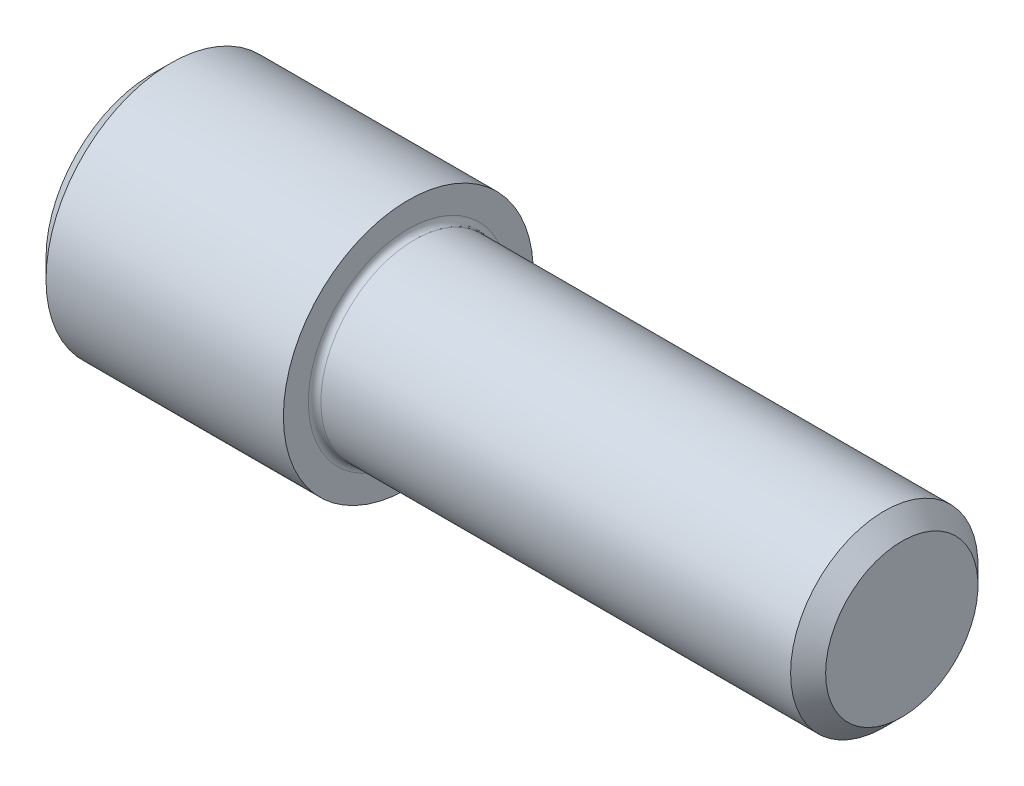
ISO-10303-21;
HEADER;
FILE_DESCRIPTION(('STEP AP214'),'2;1');
FILE_NAME('part.step','',(''),(''),'','','');
FILE_SCHEMA(('AUTOMOTIVE_DESIGN { 1 0 10303 214 1 1 1 1 }'));
ENDSEC;
DATA;
#1=APPLICATION_CONTEXT('core data for automotive mechanical design processes');
#2=APPLICATION_PROTOCOL_DEFINITION('international standard','automotive_design',2000,#1);
#3=PRODUCT_CONTEXT('',#1,'mechanical');
#4=PRODUCT('Part','Part','',(#3));
#5=PRODUCT_RELATED_PRODUCT_CATEGORY('part','',(#4));
#6=PRODUCT_DEFINITION_FORMATION('','',#4);
#7=PRODUCT_DEFINITION_CONTEXT('part definition',#1,'design');
#8=PRODUCT_DEFINITION('design','',#6,#7);
#9=PRODUCT_DEFINITION_SHAPE('','',#8);
#10=(LENGTH_UNIT() NAMED_UNIT(*) SI_UNIT(.MILLI.,.METRE.));
#11=(NAMED_UNIT(*) PLANE_ANGLE_UNIT() SI_UNIT($,.RADIAN.));
#12=(NAMED_UNIT(*) SI_UNIT($,.STERADIAN.) SOLID_ANGLE_UNIT());
#13=UNCERTAINTY_MEASURE_WITH_UNIT(LENGTH_MEASURE(1.E-05),#10,'distance_accuracy_value','');
#14=(GEOMETRIC_REPRESENTATION_CONTEXT(3) GLOBAL_UNCERTAINTY_ASSIGNED_CONTEXT((#13)) GLOBAL_UNIT_ASSIGNED_CONTEXT((#10,
#11,#12)) REPRESENTATION_CONTEXT('',''));
#15=CARTESIAN_POINT('',(0.,0.,0.));
#16=DIRECTION('',(0.,0.,1.));
#17=DIRECTION('',(1.,0.,0.));
#18=AXIS2_PLACEMENT_3D('',#15,#16,#17);
#19=CARTESIAN_POINT('',(0.,0.,0.));
#20=DIRECTION('',(-1.,0.,0.));
#21=DIRECTION('',(0.,0.,1.));
#22=AXIS2_PLACEMENT_3D('',#19,#20,#21);
#23=PLANE('',#22);
#24=DIRECTION('',(0.,-0.5,0.866025403784439));
#25=VECTOR('',#24,1.);
#26=CARTESIAN_POINT('',(0.,1.47801668912544,0.));
#27=LINE('',#26,#25);
#28=CARTESIAN_POINT('',(0.,1.47801668912544,0.));
#29=VERTEX_POINT('',#28);
#30=CARTESIAN_POINT('',(0.,0.739008344562719,1.28));
#31=VERTEX_POINT('',#30);
#32=EDGE_CURVE('E274',#29,#31,#27,.T.);
#33=ORIENTED_EDGE('',*,*,#32,.T.);
#34=DIRECTION('',(0.,1.,0.));
#35=VECTOR('',#34,1.);
#36=CARTESIAN_POINT('',(0.,-0.739008344562723,1.28));
#37=LINE('',#36,#35);
#38=CARTESIAN_POINT('',(0.,-0.739008344562723,1.28));
#39=VERTEX_POINT('',#38);
#40=EDGE_CURVE('E145',#39,#31,#37,.T.);
#41=ORIENTED_EDGE('',*,*,#40,.F.);
#42=DIRECTION('',(0.,-0.500000000000001,-0.866025403784438));
#43=VECTOR('',#42,1.);
#44=CARTESIAN_POINT('',(0.,-0.739008344562723,1.28));
#45=LINE('',#44,#43);
#46=CARTESIAN_POINT('',(0.,-1.47801668912545,0.));
#47=VERTEX_POINT('',#46);
#48=EDGE_CURVE('E277',#39,#47,#45,.T.);
#49=ORIENTED_EDGE('',*,*,#48,.T.);
#50=DIRECTION('',(0.,0.5,-0.866025403784439));
#51=VECTOR('',#50,1.);
#52=CARTESIAN_POINT('',(0.,-1.47801668912545,0.));
#53=LINE('',#52,#51);
#54=CARTESIAN_POINT('',(0.,-0.739008344562725,-1.28));
#55=VERTEX_POINT('',#54);
#56=EDGE_CURVE('E280',#47,#55,#53,.T.);
#57=ORIENTED_EDGE('',*,*,#56,.T.);
#58=DIRECTION('',(0.,-1.,0.));
#59=VECTOR('',#58,1.);
#60=CARTESIAN_POINT('',(0.,0.739008344562717,-1.28));
#61=LINE('',#60,#59);
#62=CARTESIAN_POINT('',(0.,0.739008344562717,-1.28));
#63=VERTEX_POINT('',#62);
#64=EDGE_CURVE('E283',#63,#55,#61,.T.);
#65=ORIENTED_EDGE('',*,*,#64,.F.);
#66=DIRECTION('',(0.,-0.500000000000001,-0.866025403784438));
#67=VECTOR('',#66,1.);
#68=CARTESIAN_POINT('',(0.,1.47801668912544,0.));
#69=LINE('',#68,#67);
#70=EDGE_CURVE('E140',#29,#63,#69,.T.);
#71=ORIENTED_EDGE('',*,*,#70,.F.);
#72=EDGE_LOOP('',(#33,#41,#49,#57,#65,#71));
#73=FACE_BOUND('',#72,.T.);
#74=CARTESIAN_POINT('',(0.,0.,0.));
#75=DIRECTION('',(-1.,0.,0.));
#76=DIRECTION('',(0.,0.,1.));
#77=AXIS2_PLACEMENT_3D('',#74,#75,#76);
#78=CIRCLE('',#77,1.7);
#79=CARTESIAN_POINT('',(0.,0.,1.7));
#80=VERTEX_POINT('',#79);
#81=EDGE_CURVE('E169',#80,#80,#78,.T.);
#82=ORIENTED_EDGE('',*,*,#81,.T.);
#83=EDGE_LOOP('',(#82));
#84=FACE_BOUND('',#83,.T.);
#85=ADVANCED_FACE('F49',(#73,#84),#23,.T.);
#86=CARTESIAN_POINT('',(0.,0.,0.));
#87=DIRECTION('',(1.,0.,0.));
#88=DIRECTION('',(0.,0.,-1.));
#89=AXIS2_PLACEMENT_3D('',#86,#87,#88);
#90=CONICAL_SURFACE('',#89,1.7,0.78539816339745);
#91=CARTESIAN_POINT('',(0.300000000000002,0.,0.));
#92=DIRECTION('',(-1.,0.,0.));
#93=DIRECTION('',(0.,0.,1.));
#94=AXIS2_PLACEMENT_3D('',#91,#92,#93);
#95=CIRCLE('',#94,2.);
#96=CARTESIAN_POINT('',(0.300000000000002,0.,2.));
#97=VERTEX_POINT('',#96);
#98=EDGE_CURVE('E166',#97,#97,#95,.T.);
#99=ORIENTED_EDGE('',*,*,#98,.T.);
#100=EDGE_LOOP('',(#99));
#101=FACE_BOUND('',#100,.T.);
#102=ORIENTED_EDGE('',*,*,#81,.F.);
#103=EDGE_LOOP('',(#102));
#104=FACE_BOUND('',#103,.T.);
#105=ADVANCED_FACE('F190',(#101,#104),#90,.T.);
#106=CARTESIAN_POINT('',(-31.75,0.,0.));
#107=DIRECTION('',(-1.,0.,0.));
#108=DIRECTION('',(0.,0.,1.));
#109=AXIS2_PLACEMENT_3D('',#106,#107,#108);
#110=CYLINDRICAL_SURFACE('',#109,2.);
#111=CARTESIAN_POINT('',(4.1,0.,0.));
#112=DIRECTION('',(-1.,0.,0.));
#113=DIRECTION('',(0.,0.,1.));
#114=AXIS2_PLACEMENT_3D('',#111,#112,#113);
#115=CIRCLE('',#114,2.);
#116=CARTESIAN_POINT('',(4.1,0.,2.));
#117=VERTEX_POINT('',#116);
#118=EDGE_CURVE('E163',#117,#117,#115,.T.);
#119=ORIENTED_EDGE('',*,*,#118,.T.);
#120=EDGE_LOOP('',(#119));
#121=FACE_BOUND('',#120,.T.);
#122=ORIENTED_EDGE('',*,*,#98,.F.);
#123=EDGE_LOOP('',(#122));
#124=FACE_BOUND('',#123,.T.);
#125=ADVANCED_FACE('F195',(#121,#124),#110,.T.);
#126=CARTESIAN_POINT('',(4.1,2.,0.));
#127=DIRECTION('',(1.,0.,0.));
#128=DIRECTION('',(0.,0.,-1.));
#129=AXIS2_PLACEMENT_3D('',#126,#127,#128);
#130=PLANE('',#129);
#131=CARTESIAN_POINT('',(4.1,0.,0.));
#132=DIRECTION('',(1.,0.,0.));
#133=DIRECTION('',(0.,0.,-1.));
#134=AXIS2_PLACEMENT_3D('',#131,#132,#133);
#135=CIRCLE('',#134,1.59999999999997);
#136=CARTESIAN_POINT('',(4.1,0.,-1.59999999999997));
#137=VERTEX_POINT('',#136);
#138=EDGE_CURVE('E57',#137,#137,#135,.F.);
#139=ORIENTED_EDGE('',*,*,#138,.T.);
#140=EDGE_LOOP('',(#139));
#141=FACE_BOUND('',#140,.T.);
#142=ORIENTED_EDGE('',*,*,#118,.F.);
#143=EDGE_LOOP('',(#142));
#144=FACE_BOUND('',#143,.T.);
#145=ADVANCED_FACE('F174',(#141,#144),#130,.T.);
#146=CARTESIAN_POINT('',(-31.75,0.,0.));
#147=DIRECTION('',(-1.,0.,0.));
#148=DIRECTION('',(0.,0.,1.));
#149=AXIS2_PLACEMENT_3D('',#146,#147,#148);
#150=CYLINDRICAL_SURFACE('',#149,1.49999999999997);
#151=CARTESIAN_POINT('',(4.2,0.,0.));
#152=DIRECTION('',(1.,0.,0.));
#153=DIRECTION('',(0.,0.,-1.));
#154=AXIS2_PLACEMENT_3D('',#151,#152,#153);
#155=CIRCLE('',#154,1.49999999999997);
#156=CARTESIAN_POINT('',(4.2,0.,-1.49999999999997));
#157=VERTEX_POINT('',#156);
#158=EDGE_CURVE('E13',#157,#157,#155,.T.);
#159=ORIENTED_EDGE('',*,*,#158,.T.);
#160=EDGE_LOOP('',(#159));
#161=FACE_BOUND('',#160,.T.);
#162=CARTESIAN_POINT('',(11.7195,0.,0.));
#163=DIRECTION('',(-1.,0.,0.));
#164=DIRECTION('',(0.,0.,1.));
#165=AXIS2_PLACEMENT_3D('',#162,#163,#164);
#166=CIRCLE('',#165,1.49999999999995);
#167=CARTESIAN_POINT('',(11.7195,0.,1.49999999999995));
#168=VERTEX_POINT('',#167);
#169=EDGE_CURVE('E160',#168,#168,#166,.T.);
#170=ORIENTED_EDGE('',*,*,#169,.T.);
#171=EDGE_LOOP('',(#170));
#172=FACE_BOUND('',#171,.T.);
#173=ADVANCED_FACE('F205',(#161,#172),#150,.T.);
#174=CARTESIAN_POINT('',(12.,0.,0.));
#175=DIRECTION('',(-1.,0.,0.));
#176=DIRECTION('',(0.,0.,1.));
#177=AXIS2_PLACEMENT_3D('',#174,#175,#176);
#178=CONICAL_SURFACE('',#177,1.2195,0.785398163397311);
#179=ORIENTED_EDGE('',*,*,#169,.F.);
#180=EDGE_LOOP('',(#179));
#181=FACE_BOUND('',#180,.T.);
#182=CARTESIAN_POINT('',(12.,0.,0.));
#183=DIRECTION('',(-1.,0.,0.));
#184=DIRECTION('',(0.,0.,1.));
#185=AXIS2_PLACEMENT_3D('',#182,#183,#184);
#186=CIRCLE('',#185,1.2195);
#187=CARTESIAN_POINT('',(12.,0.,1.2195));
#188=VERTEX_POINT('',#187);
#189=EDGE_CURVE('E156',#188,#188,#186,.T.);
#190=ORIENTED_EDGE('',*,*,#189,.T.);
#191=EDGE_LOOP('',(#190));
#192=FACE_BOUND('',#191,.T.);
#193=ADVANCED_FACE('F185',(#181,#192),#178,.T.);
#194=CARTESIAN_POINT('',(12.,1.2195,0.));
#195=DIRECTION('',(1.,0.,0.));
#196=DIRECTION('',(0.,0.,-1.));
#197=AXIS2_PLACEMENT_3D('',#194,#195,#196);
#198=PLANE('',#197);
#199=ORIENTED_EDGE('',*,*,#189,.F.);
#200=EDGE_LOOP('',(#199));
#201=FACE_BOUND('',#200,.T.);
#202=ADVANCED_FACE('F178',(#201),#198,.T.);
#203=CARTESIAN_POINT('',(4.2,0.,0.));
#204=DIRECTION('',(1.,0.,0.));
#205=DIRECTION('',(0.,0.,-1.));
#206=AXIS2_PLACEMENT_3D('',#203,#204,#205);
#207=TOROIDAL_SURFACE('',#206,1.59999999999997,0.1);
#208=ORIENTED_EDGE('',*,*,#158,.F.);
#209=EDGE_LOOP('',(#208));
#210=FACE_BOUND('',#209,.T.);
#211=ORIENTED_EDGE('',*,*,#138,.F.);
#212=EDGE_LOOP('',(#211));
#213=FACE_BOUND('',#212,.T.);
#214=ADVANCED_FACE('F51',(#210,#213),#207,.F.);
#215=CARTESIAN_POINT('',(1.3,1.47801668912544,0.));
#216=DIRECTION('',(0.,-0.866025403784439,-0.5));
#217=DIRECTION('',(0.,0.5,-0.866025403784439));
#218=AXIS2_PLACEMENT_3D('',#215,#216,#217);
#219=PLANE('',#218);
#220=ORIENTED_EDGE('',*,*,#32,.F.);
#221=DIRECTION('',(-1.,0.,0.));
#222=VECTOR('',#221,1.);
#223=CARTESIAN_POINT('',(1.3,1.47801668912544,0.));
#224=LINE('',#223,#222);
#225=CARTESIAN_POINT('',(1.3,1.47801668912544,0.));
#226=VERTEX_POINT('',#225);
#227=EDGE_CURVE('E264',#226,#29,#224,.T.);
#228=ORIENTED_EDGE('',*,*,#227,.F.);
#229=DIRECTION('',(0.,-0.5,0.866025403784439));
#230=VECTOR('',#229,1.);
#231=CARTESIAN_POINT('',(1.3,1.47801668912544,0.));
#232=LINE('',#231,#230);
#233=CARTESIAN_POINT('',(1.3,1.10851251684408,0.639999999999998));
#234=VERTEX_POINT('',#233);
#235=EDGE_CURVE('E132',#226,#234,#232,.T.);
#236=ORIENTED_EDGE('',*,*,#235,.T.);
#237=CARTESIAN_POINT('',(1.3,0.739008344562719,1.28));
#238=VERTEX_POINT('',#237);
#239=EDGE_CURVE('E123',#234,#238,#232,.T.);
#240=ORIENTED_EDGE('',*,*,#239,.T.);
#241=DIRECTION('',(-1.,0.,0.));
#242=VECTOR('',#241,1.);
#243=CARTESIAN_POINT('',(1.3,0.739008344562719,1.28));
#244=LINE('',#243,#242);
#245=EDGE_CURVE('E137',#238,#31,#244,.T.);
#246=ORIENTED_EDGE('',*,*,#245,.T.);
#247=EDGE_LOOP('',(#220,#228,#236,#240,#246));
#248=FACE_BOUND('',#247,.T.);
#249=ADVANCED_FACE('F136',(#248),#219,.T.);
#250=CARTESIAN_POINT('',(1.3,-0.739008344562723,1.28));
#251=DIRECTION('',(0.,0.,1.));
#252=DIRECTION('',(0.,-1.,0.));
#253=AXIS2_PLACEMENT_3D('',#250,#251,#252);
#254=PLANE('',#253);
#255=ORIENTED_EDGE('',*,*,#40,.T.);
#256=ORIENTED_EDGE('',*,*,#245,.F.);
#257=DIRECTION('',(0.,1.,0.));
#258=VECTOR('',#257,1.);
#259=CARTESIAN_POINT('',(1.3,-0.739008344562723,1.28));
#260=LINE('',#259,#258);
#261=CARTESIAN_POINT('',(1.3,0.,1.28));
#262=VERTEX_POINT('',#261);
#263=EDGE_CURVE('E120',#262,#238,#260,.T.);
#264=ORIENTED_EDGE('',*,*,#263,.F.);
#265=CARTESIAN_POINT('',(1.3,-0.739008344562723,1.28));
#266=VERTEX_POINT('',#265);
#267=EDGE_CURVE('E131',#266,#262,#260,.T.);
#268=ORIENTED_EDGE('',*,*,#267,.F.);
#269=DIRECTION('',(-1.,0.,0.));
#270=VECTOR('',#269,1.);
#271=CARTESIAN_POINT('',(1.3,-0.739008344562723,1.28));
#272=LINE('',#271,#270);
#273=EDGE_CURVE('E147',#266,#39,#272,.T.);
#274=ORIENTED_EDGE('',*,*,#273,.T.);
#275=EDGE_LOOP('',(#255,#256,#264,#268,#274));
#276=FACE_BOUND('',#275,.T.);
#277=ADVANCED_FACE('F142',(#276),#254,.F.);
#278=CARTESIAN_POINT('',(1.3,-0.739008344562723,1.28));
#279=DIRECTION('',(0.,0.866025403784438,-0.500000000000001));
#280=DIRECTION('',(0.,0.500000000000001,0.866025403784438));
#281=AXIS2_PLACEMENT_3D('',#278,#279,#280);
#282=PLANE('',#281);
#283=ORIENTED_EDGE('',*,*,#48,.F.);
#284=ORIENTED_EDGE('',*,*,#273,.F.);
#285=DIRECTION('',(0.,-0.500000000000001,-0.866025403784438));
#286=VECTOR('',#285,1.);
#287=CARTESIAN_POINT('',(1.3,-0.739008344562723,1.28));
#288=LINE('',#287,#286);
#289=CARTESIAN_POINT('',(1.3,-1.10851251684408,0.640000000000003));
#290=VERTEX_POINT('',#289);
#291=EDGE_CURVE('E303',#266,#290,#288,.T.);
#292=ORIENTED_EDGE('',*,*,#291,.T.);
#293=CARTESIAN_POINT('',(1.3,-1.47801668912545,0.));
#294=VERTEX_POINT('',#293);
#295=EDGE_CURVE('E292',#290,#294,#288,.T.);
#296=ORIENTED_EDGE('',*,*,#295,.T.);
#297=DIRECTION('',(-1.,0.,0.));
#298=VECTOR('',#297,1.);
#299=CARTESIAN_POINT('',(1.3,-1.47801668912545,0.));
#300=LINE('',#299,#298);
#301=EDGE_CURVE('E152',#294,#47,#300,.T.);
#302=ORIENTED_EDGE('',*,*,#301,.T.);
#303=EDGE_LOOP('',(#283,#284,#292,#296,#302));
#304=FACE_BOUND('',#303,.T.);
#305=ADVANCED_FACE('F218',(#304),#282,.T.);
#306=CARTESIAN_POINT('',(1.3,-1.47801668912545,0.));
#307=DIRECTION('',(0.,0.866025403784439,0.5));
#308=DIRECTION('',(0.,-0.5,0.866025403784439));
#309=AXIS2_PLACEMENT_3D('',#306,#307,#308);
#310=PLANE('',#309);
#311=ORIENTED_EDGE('',*,*,#56,.F.);
#312=ORIENTED_EDGE('',*,*,#301,.F.);
#313=DIRECTION('',(0.,0.5,-0.866025403784439));
#314=VECTOR('',#313,1.);
#315=CARTESIAN_POINT('',(1.3,-1.47801668912545,0.));
#316=LINE('',#315,#314);
#317=CARTESIAN_POINT('',(1.3,-1.10851251684409,-0.640000000000002));
#318=VERTEX_POINT('',#317);
#319=EDGE_CURVE('E270',#294,#318,#316,.T.);
#320=ORIENTED_EDGE('',*,*,#319,.T.);
#321=CARTESIAN_POINT('',(1.3,-0.739008344562725,-1.28));
#322=VERTEX_POINT('',#321);
#323=EDGE_CURVE('E302',#318,#322,#316,.T.);
#324=ORIENTED_EDGE('',*,*,#323,.T.);
#325=DIRECTION('',(-1.,0.,0.));
#326=VECTOR('',#325,1.);
#327=CARTESIAN_POINT('',(1.3,-0.739008344562725,-1.28));
#328=LINE('',#327,#326);
#329=EDGE_CURVE('E263',#322,#55,#328,.T.);
#330=ORIENTED_EDGE('',*,*,#329,.T.);
#331=EDGE_LOOP('',(#311,#312,#320,#324,#330));
#332=FACE_BOUND('',#331,.T.);
#333=ADVANCED_FACE('F221',(#332),#310,.T.);
#334=CARTESIAN_POINT('',(1.3,0.739008344562717,-1.28));
#335=DIRECTION('',(0.,0.,-1.));
#336=DIRECTION('',(0.,1.,0.));
#337=AXIS2_PLACEMENT_3D('',#334,#335,#336);
#338=PLANE('',#337);
#339=ORIENTED_EDGE('',*,*,#64,.T.);
#340=ORIENTED_EDGE('',*,*,#329,.F.);
#341=DIRECTION('',(0.,-1.,0.));
#342=VECTOR('',#341,1.);
#343=CARTESIAN_POINT('',(1.3,0.739008344562717,-1.28));
#344=LINE('',#343,#342);
#345=CARTESIAN_POINT('',(1.3,0.,-1.28));
#346=VERTEX_POINT('',#345);
#347=EDGE_CURVE('E267',#346,#322,#344,.T.);
#348=ORIENTED_EDGE('',*,*,#347,.F.);
#349=CARTESIAN_POINT('',(1.3,0.739008344562717,-1.28));
#350=VERTEX_POINT('',#349);
#351=EDGE_CURVE('E64',#350,#346,#344,.T.);
#352=ORIENTED_EDGE('',*,*,#351,.F.);
#353=DIRECTION('',(-1.,0.,0.));
#354=VECTOR('',#353,1.);
#355=CARTESIAN_POINT('',(1.3,0.739008344562717,-1.28));
#356=LINE('',#355,#354);
#357=EDGE_CURVE('E260',#350,#63,#356,.T.);
#358=ORIENTED_EDGE('',*,*,#357,.T.);
#359=EDGE_LOOP('',(#339,#340,#348,#352,#358));
#360=FACE_BOUND('',#359,.T.);
#361=ADVANCED_FACE('F225',(#360),#338,.F.);
#362=CARTESIAN_POINT('',(1.3,1.47801668912544,0.));
#363=DIRECTION('',(0.,0.866025403784438,-0.500000000000001));
#364=DIRECTION('',(0.,0.500000000000001,0.866025403784438));
#365=AXIS2_PLACEMENT_3D('',#362,#363,#364);
#366=PLANE('',#365);
#367=ORIENTED_EDGE('',*,*,#70,.T.);
#368=ORIENTED_EDGE('',*,*,#357,.F.);
#369=DIRECTION('',(0.,-0.500000000000001,-0.866025403784438));
#370=VECTOR('',#369,1.);
#371=CARTESIAN_POINT('',(1.3,1.47801668912544,0.));
#372=LINE('',#371,#370);
#373=CARTESIAN_POINT('',(1.3,1.10851251684408,-0.640000000000001));
#374=VERTEX_POINT('',#373);
#375=EDGE_CURVE('E250',#374,#350,#372,.T.);
#376=ORIENTED_EDGE('',*,*,#375,.F.);
#377=EDGE_CURVE('E256',#226,#374,#372,.T.);
#378=ORIENTED_EDGE('',*,*,#377,.F.);
#379=ORIENTED_EDGE('',*,*,#227,.T.);
#380=EDGE_LOOP('',(#367,#368,#376,#378,#379));
#381=FACE_BOUND('',#380,.T.);
#382=ADVANCED_FACE('F229',(#381),#366,.F.);
#383=CARTESIAN_POINT('',(1.3,1.47801668912544,0.));
#384=DIRECTION('',(1.,0.,0.));
#385=DIRECTION('',(0.,0.,-1.));
#386=AXIS2_PLACEMENT_3D('',#383,#384,#385);
#387=PLANE('',#386);
#388=ORIENTED_EDGE('',*,*,#347,.T.);
#389=ORIENTED_EDGE('',*,*,#323,.F.);
#390=CARTESIAN_POINT('',(1.3,0.,0.));
#391=DIRECTION('',(-1.,0.,0.));
#392=DIRECTION('',(0.,0.,1.));
#393=AXIS2_PLACEMENT_3D('',#390,#391,#392);
#394=CIRCLE('',#393,1.28);
#395=EDGE_CURVE('E298',#346,#318,#394,.T.);
#396=ORIENTED_EDGE('',*,*,#395,.F.);
#397=EDGE_LOOP('',(#388,#389,#396));
#398=FACE_BOUND('',#397,.T.);
#399=ADVANCED_FACE('F233',(#398),#387,.F.);
#400=ORIENTED_EDGE('',*,*,#319,.F.);
#401=ORIENTED_EDGE('',*,*,#295,.F.);
#402=EDGE_CURVE('E150',#318,#290,#394,.T.);
#403=ORIENTED_EDGE('',*,*,#402,.F.);
#404=EDGE_LOOP('',(#400,#401,#403));
#405=FACE_BOUND('',#404,.T.);
#406=ADVANCED_FACE('F236',(#405),#387,.F.);
#407=ORIENTED_EDGE('',*,*,#291,.F.);
#408=ORIENTED_EDGE('',*,*,#267,.T.);
#409=EDGE_CURVE('E146',#290,#262,#394,.T.);
#410=ORIENTED_EDGE('',*,*,#409,.F.);
#411=EDGE_LOOP('',(#407,#408,#410));
#412=FACE_BOUND('',#411,.T.);
#413=ADVANCED_FACE('F241',(#412),#387,.F.);
#414=ORIENTED_EDGE('',*,*,#263,.T.);
#415=ORIENTED_EDGE('',*,*,#239,.F.);
#416=EDGE_CURVE('E126',#262,#234,#394,.T.);
#417=ORIENTED_EDGE('',*,*,#416,.F.);
#418=EDGE_LOOP('',(#414,#415,#417));
#419=FACE_BOUND('',#418,.T.);
#420=ADVANCED_FACE('F122',(#419),#387,.F.);
#421=ORIENTED_EDGE('',*,*,#235,.F.);
#422=ORIENTED_EDGE('',*,*,#377,.T.);
#423=EDGE_CURVE('E157',#234,#374,#394,.T.);
#424=ORIENTED_EDGE('',*,*,#423,.F.);
#425=EDGE_LOOP('',(#421,#422,#424));
#426=FACE_BOUND('',#425,.T.);
#427=ADVANCED_FACE('F244',(#426),#387,.F.);
#428=ORIENTED_EDGE('',*,*,#375,.T.);
#429=ORIENTED_EDGE('',*,*,#351,.T.);
#430=EDGE_CURVE('E253',#374,#346,#394,.T.);
#431=ORIENTED_EDGE('',*,*,#430,.F.);
#432=EDGE_LOOP('',(#428,#429,#431));
#433=FACE_BOUND('',#432,.T.);
#434=ADVANCED_FACE('F214',(#433),#387,.F.);
#435=CARTESIAN_POINT('',(1.3,0.,0.));
#436=DIRECTION('',(-1.,0.,0.));
#437=DIRECTION('',(0.,0.,1.));
#438=AXIS2_PLACEMENT_3D('',#435,#436,#437);
#439=CONICAL_SURFACE('',#438,1.28,1.0471975511966);
#440=CARTESIAN_POINT('',(2.03900834456273,0.,0.));
#441=VERTEX_POINT('',#440);
#442=VERTEX_LOOP('',#441);
#443=FACE_BOUND('',#442,.T.);
#444=ORIENTED_EDGE('',*,*,#416,.T.);
#445=ORIENTED_EDGE('',*,*,#423,.T.);
#446=ORIENTED_EDGE('',*,*,#430,.T.);
#447=ORIENTED_EDGE('',*,*,#395,.T.);
#448=ORIENTED_EDGE('',*,*,#402,.T.);
#449=ORIENTED_EDGE('',*,*,#409,.T.);
#450=EDGE_LOOP('',(#444,#445,#446,#447,#448,#449));
#451=FACE_BOUND('',#450,.T.);
#452=ADVANCED_FACE('F212',(#443,#451),#439,.F.);
#453=CLOSED_SHELL('',(#85,#105,#125,#145,#173,#193,#202,#214,#249,#277,#305,#333,#361,#382,#399,
#406,#413,#420,#427,#434,#452));
#454=MANIFOLD_SOLID_BREP('B2',#453);
#455=ADVANCED_BREP_SHAPE_REPRESENTATION('',(#18,#454),#14);
#456=SHAPE_DEFINITION_REPRESENTATION(#9,#455);
ENDSEC;
END-ISO-10303-21;
